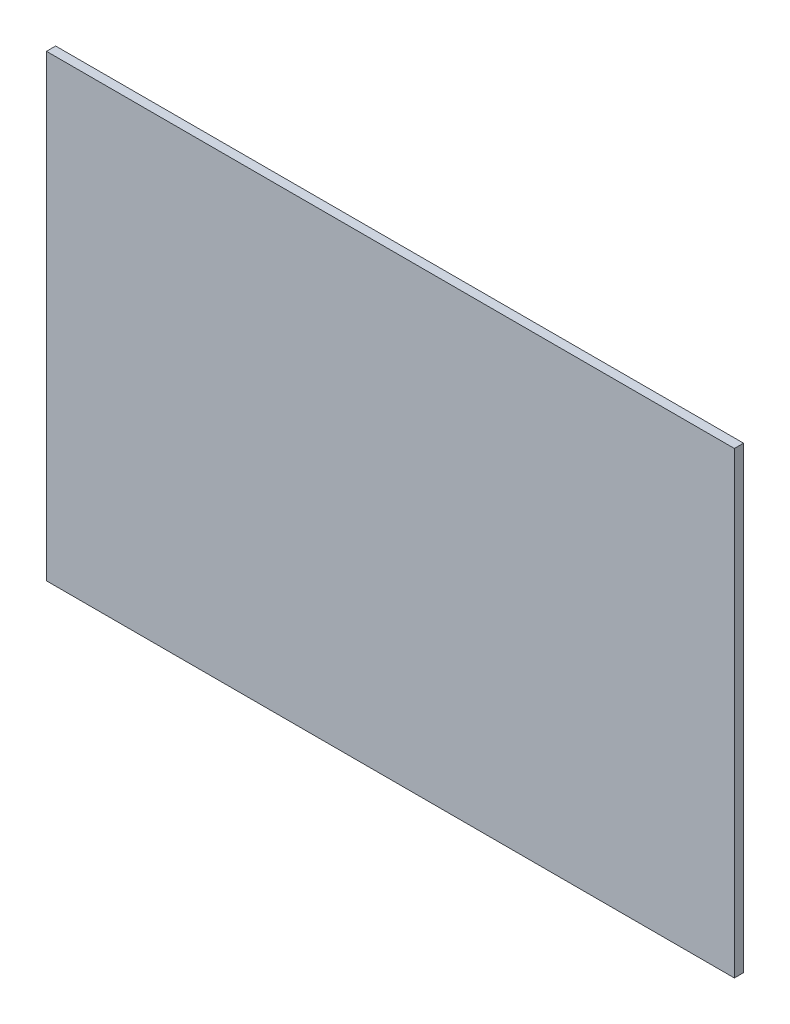
ISO-10303-21;
HEADER;
FILE_DESCRIPTION(('STEP AP214'),'2;1');
FILE_NAME('part.step','',(''),(''),'','','');
FILE_SCHEMA(('AUTOMOTIVE_DESIGN { 1 0 10303 214 1 1 1 1 }'));
ENDSEC;
DATA;
#1=APPLICATION_CONTEXT('core data for automotive mechanical design processes');
#2=APPLICATION_PROTOCOL_DEFINITION('international standard','automotive_design',2000,#1);
#3=PRODUCT_CONTEXT('',#1,'mechanical');
#4=PRODUCT('Part','Part','',(#3));
#5=PRODUCT_RELATED_PRODUCT_CATEGORY('part','',(#4));
#6=PRODUCT_DEFINITION_FORMATION('','',#4);
#7=PRODUCT_DEFINITION_CONTEXT('part definition',#1,'design');
#8=PRODUCT_DEFINITION('design','',#6,#7);
#9=PRODUCT_DEFINITION_SHAPE('','',#8);
#10=(LENGTH_UNIT() NAMED_UNIT(*) SI_UNIT(.MILLI.,.METRE.));
#11=(NAMED_UNIT(*) PLANE_ANGLE_UNIT() SI_UNIT($,.RADIAN.));
#12=(NAMED_UNIT(*) SI_UNIT($,.STERADIAN.) SOLID_ANGLE_UNIT());
#13=UNCERTAINTY_MEASURE_WITH_UNIT(LENGTH_MEASURE(1.E-05),#10,'distance_accuracy_value','');
#14=(GEOMETRIC_REPRESENTATION_CONTEXT(3) GLOBAL_UNCERTAINTY_ASSIGNED_CONTEXT((#13)) GLOBAL_UNIT_ASSIGNED_CONTEXT((#10,
#11,#12)) REPRESENTATION_CONTEXT('',''));
#15=CARTESIAN_POINT('',(0.,0.,0.));
#16=DIRECTION('',(0.,0.,1.));
#17=DIRECTION('',(1.,0.,0.));
#18=AXIS2_PLACEMENT_3D('',#15,#16,#17);
#19=CARTESIAN_POINT('',(-352.653061224484,0.,-12.));
#20=DIRECTION('',(1.,0.,0.));
#21=DIRECTION('',(0.,0.,-1.));
#22=AXIS2_PLACEMENT_3D('',#19,#20,#21);
#23=PLANE('',#22);
#24=DIRECTION('',(0.,1.,0.));
#25=VECTOR('',#24,1.);
#26=CARTESIAN_POINT('',(-352.653061224484,0.,0.));
#27=LINE('',#26,#25);
#28=CARTESIAN_POINT('',(-352.653061224484,0.,0.));
#29=VERTEX_POINT('',#28);
#30=CARTESIAN_POINT('',(-352.653061224484,600.,0.));
#31=VERTEX_POINT('',#30);
#32=EDGE_CURVE('E96',#29,#31,#27,.T.);
#33=ORIENTED_EDGE('',*,*,#32,.T.);
#34=DIRECTION('',(0.,0.,1.));
#35=VECTOR('',#34,1.);
#36=CARTESIAN_POINT('',(-352.653061224484,600.,-12.));
#37=LINE('',#36,#35);
#38=CARTESIAN_POINT('',(-352.653061224484,600.,-12.));
#39=VERTEX_POINT('',#38);
#40=EDGE_CURVE('E11',#39,#31,#37,.T.);
#41=ORIENTED_EDGE('',*,*,#40,.F.);
#42=DIRECTION('',(0.,1.,0.));
#43=VECTOR('',#42,1.);
#44=CARTESIAN_POINT('',(-352.653061224484,0.,-12.));
#45=LINE('',#44,#43);
#46=CARTESIAN_POINT('',(-352.653061224484,0.,-12.));
#47=VERTEX_POINT('',#46);
#48=EDGE_CURVE('E82',#47,#39,#45,.T.);
#49=ORIENTED_EDGE('',*,*,#48,.F.);
#50=DIRECTION('',(0.,0.,1.));
#51=VECTOR('',#50,1.);
#52=CARTESIAN_POINT('',(-352.653061224484,0.,-12.));
#53=LINE('',#52,#51);
#54=EDGE_CURVE('E49',#47,#29,#53,.T.);
#55=ORIENTED_EDGE('',*,*,#54,.T.);
#56=EDGE_LOOP('',(#33,#41,#49,#55));
#57=FACE_BOUND('',#56,.T.);
#58=ADVANCED_FACE('F33',(#57),#23,.F.);
#59=CARTESIAN_POINT('',(-352.653061224484,600.,-12.));
#60=DIRECTION('',(0.,-1.,0.));
#61=DIRECTION('',(1.,0.,0.));
#62=AXIS2_PLACEMENT_3D('',#59,#60,#61);
#63=PLANE('',#62);
#64=DIRECTION('',(1.,0.,0.));
#65=VECTOR('',#64,1.);
#66=CARTESIAN_POINT('',(-352.653061224484,600.,0.));
#67=LINE('',#66,#65);
#68=CARTESIAN_POINT('',(547.346938775516,600.,0.));
#69=VERTEX_POINT('',#68);
#70=EDGE_CURVE('E87',#31,#69,#67,.T.);
#71=ORIENTED_EDGE('',*,*,#70,.T.);
#72=DIRECTION('',(0.,0.,1.));
#73=VECTOR('',#72,1.);
#74=CARTESIAN_POINT('',(547.346938775516,600.,-12.));
#75=LINE('',#74,#73);
#76=CARTESIAN_POINT('',(547.346938775516,600.,-12.));
#77=VERTEX_POINT('',#76);
#78=EDGE_CURVE('E41',#77,#69,#75,.T.);
#79=ORIENTED_EDGE('',*,*,#78,.F.);
#80=DIRECTION('',(1.,0.,0.));
#81=VECTOR('',#80,1.);
#82=CARTESIAN_POINT('',(-352.653061224484,600.,-12.));
#83=LINE('',#82,#81);
#84=EDGE_CURVE('E74',#39,#77,#83,.T.);
#85=ORIENTED_EDGE('',*,*,#84,.F.);
#86=ORIENTED_EDGE('',*,*,#40,.T.);
#87=EDGE_LOOP('',(#71,#79,#85,#86));
#88=FACE_BOUND('',#87,.T.);
#89=ADVANCED_FACE('F86',(#88),#63,.F.);
#90=CARTESIAN_POINT('',(547.346938775516,0.,-12.));
#91=DIRECTION('',(1.,0.,0.));
#92=DIRECTION('',(0.,0.,-1.));
#93=AXIS2_PLACEMENT_3D('',#90,#91,#92);
#94=PLANE('',#93);
#95=DIRECTION('',(0.,1.,0.));
#96=VECTOR('',#95,1.);
#97=CARTESIAN_POINT('',(547.346938775516,0.,0.));
#98=LINE('',#97,#96);
#99=CARTESIAN_POINT('',(547.346938775516,0.,0.));
#100=VERTEX_POINT('',#99);
#101=EDGE_CURVE('E99',#100,#69,#98,.T.);
#102=ORIENTED_EDGE('',*,*,#101,.F.);
#103=DIRECTION('',(0.,0.,1.));
#104=VECTOR('',#103,1.);
#105=CARTESIAN_POINT('',(547.346938775516,0.,-12.));
#106=LINE('',#105,#104);
#107=CARTESIAN_POINT('',(547.346938775516,0.,-12.));
#108=VERTEX_POINT('',#107);
#109=EDGE_CURVE('E63',#108,#100,#106,.T.);
#110=ORIENTED_EDGE('',*,*,#109,.F.);
#111=DIRECTION('',(0.,1.,0.));
#112=VECTOR('',#111,1.);
#113=CARTESIAN_POINT('',(547.346938775516,0.,-12.));
#114=LINE('',#113,#112);
#115=EDGE_CURVE('E81',#108,#77,#114,.T.);
#116=ORIENTED_EDGE('',*,*,#115,.T.);
#117=ORIENTED_EDGE('',*,*,#78,.T.);
#118=EDGE_LOOP('',(#102,#110,#116,#117));
#119=FACE_BOUND('',#118,.T.);
#120=ADVANCED_FACE('F90',(#119),#94,.T.);
#121=CARTESIAN_POINT('',(-352.653061224484,0.,-12.));
#122=DIRECTION('',(0.,-1.,0.));
#123=DIRECTION('',(0.,0.,-1.));
#124=AXIS2_PLACEMENT_3D('',#121,#122,#123);
#125=PLANE('',#124);
#126=DIRECTION('',(1.,0.,0.));
#127=VECTOR('',#126,1.);
#128=CARTESIAN_POINT('',(-352.653061224484,0.,0.));
#129=LINE('',#128,#127);
#130=EDGE_CURVE('E101',#29,#100,#129,.T.);
#131=ORIENTED_EDGE('',*,*,#130,.F.);
#132=ORIENTED_EDGE('',*,*,#54,.F.);
#133=DIRECTION('',(1.,0.,0.));
#134=VECTOR('',#133,1.);
#135=CARTESIAN_POINT('',(-352.653061224484,0.,-12.));
#136=LINE('',#135,#134);
#137=EDGE_CURVE('E91',#47,#108,#136,.T.);
#138=ORIENTED_EDGE('',*,*,#137,.T.);
#139=ORIENTED_EDGE('',*,*,#109,.T.);
#140=EDGE_LOOP('',(#131,#132,#138,#139));
#141=FACE_BOUND('',#140,.T.);
#142=ADVANCED_FACE('F107',(#141),#125,.T.);
#143=CARTESIAN_POINT('',(0.,0.,-12.));
#144=DIRECTION('',(0.,0.,-1.));
#145=DIRECTION('',(-1.,0.,0.));
#146=AXIS2_PLACEMENT_3D('',#143,#144,#145);
#147=PLANE('',#146);
#148=ORIENTED_EDGE('',*,*,#48,.T.);
#149=ORIENTED_EDGE('',*,*,#84,.T.);
#150=ORIENTED_EDGE('',*,*,#115,.F.);
#151=ORIENTED_EDGE('',*,*,#137,.F.);
#152=EDGE_LOOP('',(#148,#149,#150,#151));
#153=FACE_BOUND('',#152,.T.);
#154=ADVANCED_FACE('F78',(#153),#147,.T.);
#155=CARTESIAN_POINT('',(0.,0.,0.));
#156=DIRECTION('',(0.,0.,-1.));
#157=DIRECTION('',(-1.,0.,0.));
#158=AXIS2_PLACEMENT_3D('',#155,#156,#157);
#159=PLANE('',#158);
#160=ORIENTED_EDGE('',*,*,#32,.F.);
#161=ORIENTED_EDGE('',*,*,#130,.T.);
#162=ORIENTED_EDGE('',*,*,#101,.T.);
#163=ORIENTED_EDGE('',*,*,#70,.F.);
#164=EDGE_LOOP('',(#160,#161,#162,#163));
#165=FACE_BOUND('',#164,.T.);
#166=ADVANCED_FACE('F106',(#165),#159,.F.);
#167=CLOSED_SHELL('',(#58,#89,#120,#142,#154,#166));
#168=MANIFOLD_SOLID_BREP('B2',#167);
#169=ADVANCED_BREP_SHAPE_REPRESENTATION('',(#18,#168),#14);
#170=SHAPE_DEFINITION_REPRESENTATION(#9,#169);
ENDSEC;
END-ISO-10303-21;
